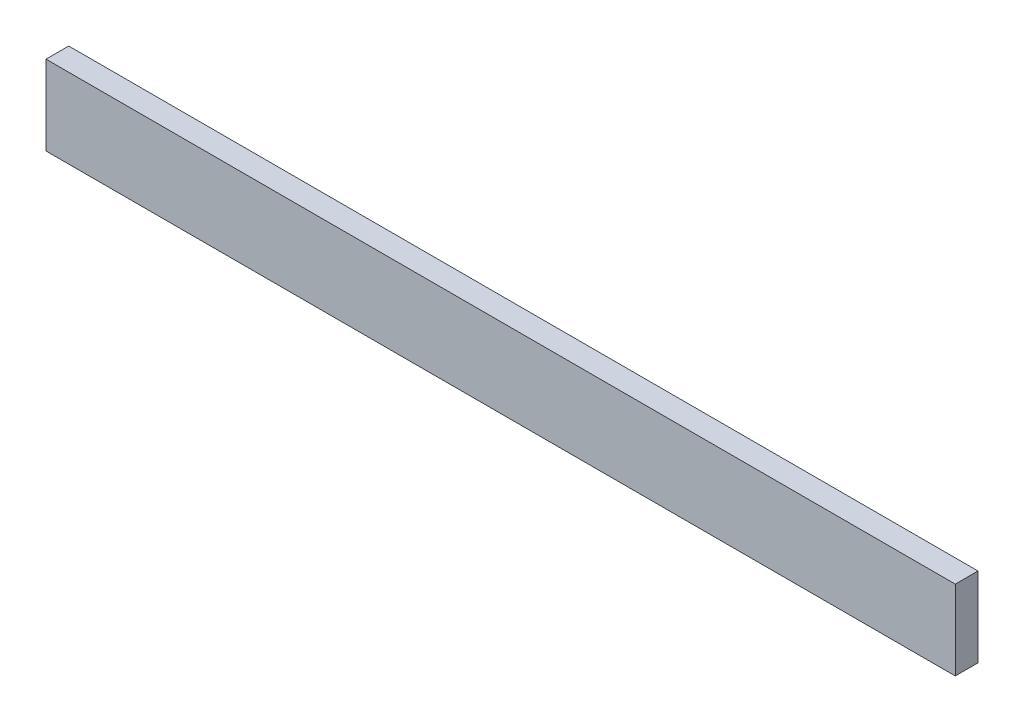
ISO-10303-21;
HEADER;
FILE_DESCRIPTION(('STEP AP214'),'2;1');
FILE_NAME('part.step','',(''),(''),'','','');
FILE_SCHEMA(('AUTOMOTIVE_DESIGN { 1 0 10303 214 1 1 1 1 }'));
ENDSEC;
DATA;
#1=APPLICATION_CONTEXT('core data for automotive mechanical design processes');
#2=APPLICATION_PROTOCOL_DEFINITION('international standard','automotive_design',2000,#1);
#3=PRODUCT_CONTEXT('',#1,'mechanical');
#4=PRODUCT('Part','Part','',(#3));
#5=PRODUCT_RELATED_PRODUCT_CATEGORY('part','',(#4));
#6=PRODUCT_DEFINITION_FORMATION('','',#4);
#7=PRODUCT_DEFINITION_CONTEXT('part definition',#1,'design');
#8=PRODUCT_DEFINITION('design','',#6,#7);
#9=PRODUCT_DEFINITION_SHAPE('','',#8);
#10=(LENGTH_UNIT() NAMED_UNIT(*) SI_UNIT(.MILLI.,.METRE.));
#11=(NAMED_UNIT(*) PLANE_ANGLE_UNIT() SI_UNIT($,.RADIAN.));
#12=(NAMED_UNIT(*) SI_UNIT($,.STERADIAN.) SOLID_ANGLE_UNIT());
#13=UNCERTAINTY_MEASURE_WITH_UNIT(LENGTH_MEASURE(1.E-05),#10,'distance_accuracy_value','');
#14=(GEOMETRIC_REPRESENTATION_CONTEXT(3) GLOBAL_UNCERTAINTY_ASSIGNED_CONTEXT((#13)) GLOBAL_UNIT_ASSIGNED_CONTEXT((#10,
#11,#12)) REPRESENTATION_CONTEXT('',''));
#15=CARTESIAN_POINT('',(0.,0.,0.));
#16=DIRECTION('',(0.,0.,1.));
#17=DIRECTION('',(1.,0.,0.));
#18=AXIS2_PLACEMENT_3D('',#15,#16,#17);
#19=CARTESIAN_POINT('',(-40.,-3.50000000000001,2.));
#20=DIRECTION('',(1.,0.,0.));
#21=DIRECTION('',(0.,0.,-1.));
#22=AXIS2_PLACEMENT_3D('',#19,#20,#21);
#23=PLANE('',#22);
#24=DIRECTION('',(0.,-1.,0.));
#25=VECTOR('',#24,1.);
#26=CARTESIAN_POINT('',(-40.,-3.50000000000001,0.));
#27=LINE('',#26,#25);
#28=CARTESIAN_POINT('',(-40.,3.49999999999999,0.));
#29=VERTEX_POINT('',#28);
#30=CARTESIAN_POINT('',(-40.,-3.50000000000001,0.));
#31=VERTEX_POINT('',#30);
#32=EDGE_CURVE('E95',#29,#31,#27,.T.);
#33=ORIENTED_EDGE('',*,*,#32,.T.);
#34=DIRECTION('',(0.,0.,-1.));
#35=VECTOR('',#34,1.);
#36=CARTESIAN_POINT('',(-40.,-3.50000000000001,2.));
#37=LINE('',#36,#35);
#38=CARTESIAN_POINT('',(-40.,-3.50000000000001,2.));
#39=VERTEX_POINT('',#38);
#40=EDGE_CURVE('E11',#39,#31,#37,.T.);
#41=ORIENTED_EDGE('',*,*,#40,.F.);
#42=DIRECTION('',(0.,-1.,0.));
#43=VECTOR('',#42,1.);
#44=CARTESIAN_POINT('',(-40.,-3.50000000000001,2.));
#45=LINE('',#44,#43);
#46=CARTESIAN_POINT('',(-40.,3.49999999999999,2.));
#47=VERTEX_POINT('',#46);
#48=EDGE_CURVE('E83',#47,#39,#45,.T.);
#49=ORIENTED_EDGE('',*,*,#48,.F.);
#50=DIRECTION('',(0.,0.,-1.));
#51=VECTOR('',#50,1.);
#52=CARTESIAN_POINT('',(-40.,3.49999999999999,2.));
#53=LINE('',#52,#51);
#54=EDGE_CURVE('E91',#47,#29,#53,.T.);
#55=ORIENTED_EDGE('',*,*,#54,.T.);
#56=EDGE_LOOP('',(#33,#41,#49,#55));
#57=FACE_BOUND('',#56,.T.);
#58=ADVANCED_FACE('F32',(#57),#23,.F.);
#59=CARTESIAN_POINT('',(40.,-3.5,2.));
#60=DIRECTION('',(0.,1.,0.));
#61=DIRECTION('',(-1.,0.,0.));
#62=AXIS2_PLACEMENT_3D('',#59,#60,#61);
#63=PLANE('',#62);
#64=DIRECTION('',(1.,0.,0.));
#65=VECTOR('',#64,1.);
#66=CARTESIAN_POINT('',(40.,-3.5,0.));
#67=LINE('',#66,#65);
#68=CARTESIAN_POINT('',(40.,-3.5,0.));
#69=VERTEX_POINT('',#68);
#70=EDGE_CURVE('E87',#31,#69,#67,.T.);
#71=ORIENTED_EDGE('',*,*,#70,.T.);
#72=DIRECTION('',(0.,0.,-1.));
#73=VECTOR('',#72,1.);
#74=CARTESIAN_POINT('',(40.,-3.5,2.));
#75=LINE('',#74,#73);
#76=CARTESIAN_POINT('',(40.,-3.5,2.));
#77=VERTEX_POINT('',#76);
#78=EDGE_CURVE('E40',#77,#69,#75,.T.);
#79=ORIENTED_EDGE('',*,*,#78,.F.);
#80=DIRECTION('',(1.,0.,0.));
#81=VECTOR('',#80,1.);
#82=CARTESIAN_POINT('',(40.,-3.5,2.));
#83=LINE('',#82,#81);
#84=EDGE_CURVE('E78',#39,#77,#83,.T.);
#85=ORIENTED_EDGE('',*,*,#84,.F.);
#86=ORIENTED_EDGE('',*,*,#40,.T.);
#87=EDGE_LOOP('',(#71,#79,#85,#86));
#88=FACE_BOUND('',#87,.T.);
#89=ADVANCED_FACE('F86',(#88),#63,.F.);
#90=CARTESIAN_POINT('',(40.,-3.5,2.));
#91=DIRECTION('',(-1.,0.,0.));
#92=DIRECTION('',(0.,0.,1.));
#93=AXIS2_PLACEMENT_3D('',#90,#91,#92);
#94=PLANE('',#93);
#95=DIRECTION('',(0.,1.,0.));
#96=VECTOR('',#95,1.);
#97=CARTESIAN_POINT('',(40.,-3.5,0.));
#98=LINE('',#97,#96);
#99=CARTESIAN_POINT('',(40.,3.5,0.));
#100=VERTEX_POINT('',#99);
#101=EDGE_CURVE('E65',#69,#100,#98,.T.);
#102=ORIENTED_EDGE('',*,*,#101,.T.);
#103=DIRECTION('',(0.,0.,-1.));
#104=VECTOR('',#103,1.);
#105=CARTESIAN_POINT('',(40.,3.5,2.));
#106=LINE('',#105,#104);
#107=CARTESIAN_POINT('',(40.,3.5,2.));
#108=VERTEX_POINT('',#107);
#109=EDGE_CURVE('E88',#108,#100,#106,.T.);
#110=ORIENTED_EDGE('',*,*,#109,.F.);
#111=DIRECTION('',(0.,1.,0.));
#112=VECTOR('',#111,1.);
#113=CARTESIAN_POINT('',(40.,-3.5,2.));
#114=LINE('',#113,#112);
#115=EDGE_CURVE('E81',#77,#108,#114,.T.);
#116=ORIENTED_EDGE('',*,*,#115,.F.);
#117=ORIENTED_EDGE('',*,*,#78,.T.);
#118=EDGE_LOOP('',(#102,#110,#116,#117));
#119=FACE_BOUND('',#118,.T.);
#120=ADVANCED_FACE('F89',(#119),#94,.F.);
#121=CARTESIAN_POINT('',(40.,3.5,2.));
#122=DIRECTION('',(0.,-1.,0.));
#123=DIRECTION('',(1.,0.,0.));
#124=AXIS2_PLACEMENT_3D('',#121,#122,#123);
#125=PLANE('',#124);
#126=DIRECTION('',(-1.,0.,0.));
#127=VECTOR('',#126,1.);
#128=CARTESIAN_POINT('',(40.,3.5,0.));
#129=LINE('',#128,#127);
#130=EDGE_CURVE('E71',#100,#29,#129,.T.);
#131=ORIENTED_EDGE('',*,*,#130,.T.);
#132=ORIENTED_EDGE('',*,*,#54,.F.);
#133=DIRECTION('',(-1.,0.,0.));
#134=VECTOR('',#133,1.);
#135=CARTESIAN_POINT('',(40.,3.5,2.));
#136=LINE('',#135,#134);
#137=EDGE_CURVE('E48',#108,#47,#136,.T.);
#138=ORIENTED_EDGE('',*,*,#137,.F.);
#139=ORIENTED_EDGE('',*,*,#109,.T.);
#140=EDGE_LOOP('',(#131,#132,#138,#139));
#141=FACE_BOUND('',#140,.T.);
#142=ADVANCED_FACE('F102',(#141),#125,.F.);
#143=CARTESIAN_POINT('',(0.,0.,2.));
#144=DIRECTION('',(0.,0.,1.));
#145=DIRECTION('',(1.,0.,0.));
#146=AXIS2_PLACEMENT_3D('',#143,#144,#145);
#147=PLANE('',#146);
#148=ORIENTED_EDGE('',*,*,#48,.T.);
#149=ORIENTED_EDGE('',*,*,#84,.T.);
#150=ORIENTED_EDGE('',*,*,#115,.T.);
#151=ORIENTED_EDGE('',*,*,#137,.T.);
#152=EDGE_LOOP('',(#148,#149,#150,#151));
#153=FACE_BOUND('',#152,.T.);
#154=ADVANCED_FACE('F79',(#153),#147,.T.);
#155=CARTESIAN_POINT('',(0.,0.,0.));
#156=DIRECTION('',(0.,0.,1.));
#157=DIRECTION('',(1.,0.,0.));
#158=AXIS2_PLACEMENT_3D('',#155,#156,#157);
#159=PLANE('',#158);
#160=ORIENTED_EDGE('',*,*,#32,.F.);
#161=ORIENTED_EDGE('',*,*,#130,.F.);
#162=ORIENTED_EDGE('',*,*,#101,.F.);
#163=ORIENTED_EDGE('',*,*,#70,.F.);
#164=EDGE_LOOP('',(#160,#161,#162,#163));
#165=FACE_BOUND('',#164,.T.);
#166=ADVANCED_FACE('F105',(#165),#159,.F.);
#167=CLOSED_SHELL('',(#58,#89,#120,#142,#154,#166));
#168=MANIFOLD_SOLID_BREP('B2',#167);
#169=ADVANCED_BREP_SHAPE_REPRESENTATION('',(#18,#168),#14);
#170=SHAPE_DEFINITION_REPRESENTATION(#9,#169);
ENDSEC;
END-ISO-10303-21;
